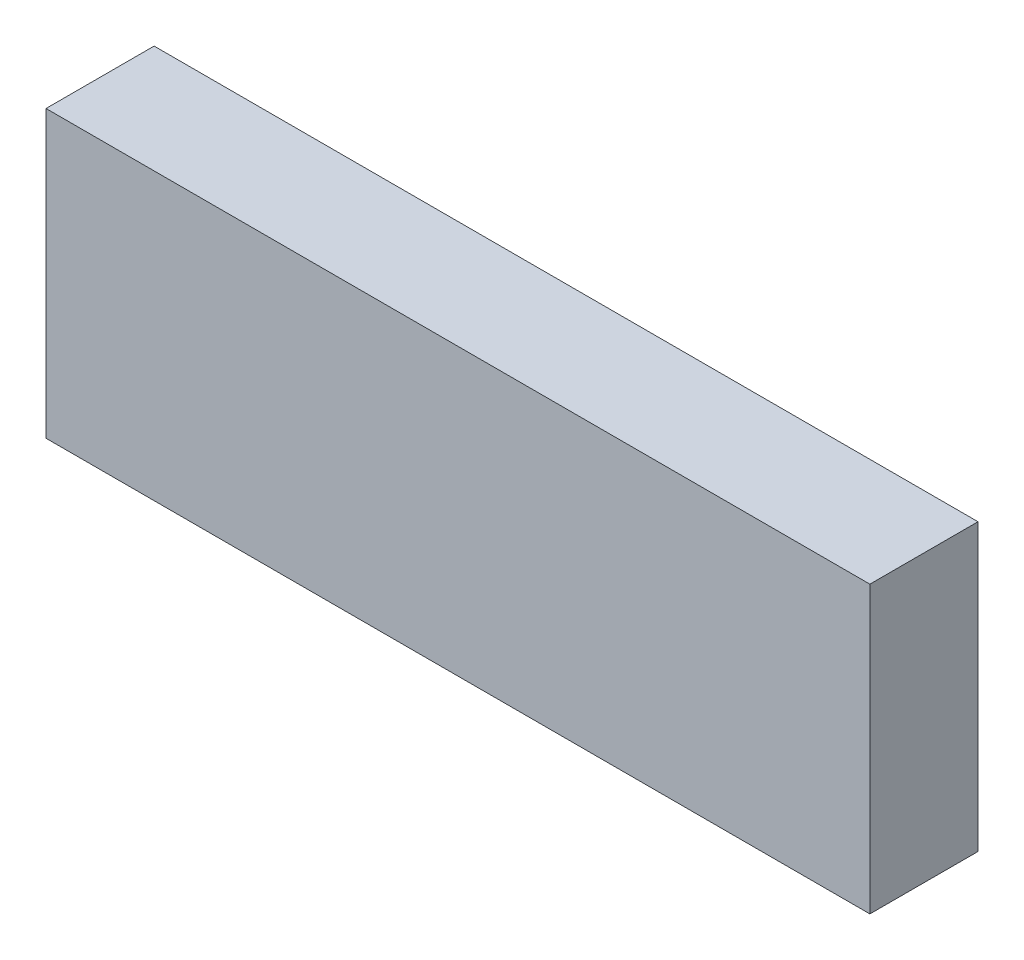
ISO-10303-21;
HEADER;
FILE_DESCRIPTION(('STEP AP214'),'2;1');
FILE_NAME('part.step','',(''),(''),'','','');
FILE_SCHEMA(('AUTOMOTIVE_DESIGN { 1 0 10303 214 1 1 1 1 }'));
ENDSEC;
DATA;
#1=APPLICATION_CONTEXT('core data for automotive mechanical design processes');
#2=APPLICATION_PROTOCOL_DEFINITION('international standard','automotive_design',2000,#1);
#3=PRODUCT_CONTEXT('',#1,'mechanical');
#4=PRODUCT('Part','Part','',(#3));
#5=PRODUCT_RELATED_PRODUCT_CATEGORY('part','',(#4));
#6=PRODUCT_DEFINITION_FORMATION('','',#4);
#7=PRODUCT_DEFINITION_CONTEXT('part definition',#1,'design');
#8=PRODUCT_DEFINITION('design','',#6,#7);
#9=PRODUCT_DEFINITION_SHAPE('','',#8);
#10=(LENGTH_UNIT() NAMED_UNIT(*) SI_UNIT(.MILLI.,.METRE.));
#11=(NAMED_UNIT(*) PLANE_ANGLE_UNIT() SI_UNIT($,.RADIAN.));
#12=(NAMED_UNIT(*) SI_UNIT($,.STERADIAN.) SOLID_ANGLE_UNIT());
#13=UNCERTAINTY_MEASURE_WITH_UNIT(LENGTH_MEASURE(1.E-05),#10,'distance_accuracy_value','');
#14=(GEOMETRIC_REPRESENTATION_CONTEXT(3) GLOBAL_UNCERTAINTY_ASSIGNED_CONTEXT((#13)) GLOBAL_UNIT_ASSIGNED_CONTEXT((#10,
#11,#12)) REPRESENTATION_CONTEXT('',''));
#15=CARTESIAN_POINT('',(0.,0.,0.));
#16=DIRECTION('',(0.,0.,1.));
#17=DIRECTION('',(1.,0.,0.));
#18=AXIS2_PLACEMENT_3D('',#15,#16,#17);
#19=CARTESIAN_POINT('',(-1.27,-1.27,1.));
#20=DIRECTION('',(1.,0.,0.));
#21=DIRECTION('',(0.,0.,-1.));
#22=AXIS2_PLACEMENT_3D('',#19,#20,#21);
#23=PLANE('',#22);
#24=DIRECTION('',(0.,-1.,0.));
#25=VECTOR('',#24,1.);
#26=CARTESIAN_POINT('',(-1.27,-1.27,0.));
#27=LINE('',#26,#25);
#28=CARTESIAN_POINT('',(-1.27,1.3716,0.));
#29=VERTEX_POINT('',#28);
#30=CARTESIAN_POINT('',(-1.27,-1.27,0.));
#31=VERTEX_POINT('',#30);
#32=EDGE_CURVE('E95',#29,#31,#27,.T.);
#33=ORIENTED_EDGE('',*,*,#32,.T.);
#34=DIRECTION('',(0.,0.,-1.));
#35=VECTOR('',#34,1.);
#36=CARTESIAN_POINT('',(-1.27,-1.27,1.));
#37=LINE('',#36,#35);
#38=CARTESIAN_POINT('',(-1.27,-1.27,1.));
#39=VERTEX_POINT('',#38);
#40=EDGE_CURVE('E11',#39,#31,#37,.T.);
#41=ORIENTED_EDGE('',*,*,#40,.F.);
#42=DIRECTION('',(0.,-1.,0.));
#43=VECTOR('',#42,1.);
#44=CARTESIAN_POINT('',(-1.27,-1.27,1.));
#45=LINE('',#44,#43);
#46=CARTESIAN_POINT('',(-1.27,1.3716,1.));
#47=VERTEX_POINT('',#46);
#48=EDGE_CURVE('E83',#47,#39,#45,.T.);
#49=ORIENTED_EDGE('',*,*,#48,.F.);
#50=DIRECTION('',(0.,0.,-1.));
#51=VECTOR('',#50,1.);
#52=CARTESIAN_POINT('',(-1.27,1.3716,1.));
#53=LINE('',#52,#51);
#54=EDGE_CURVE('E91',#47,#29,#53,.T.);
#55=ORIENTED_EDGE('',*,*,#54,.T.);
#56=EDGE_LOOP('',(#33,#41,#49,#55));
#57=FACE_BOUND('',#56,.T.);
#58=ADVANCED_FACE('F32',(#57),#23,.F.);
#59=CARTESIAN_POINT('',(6.35,-1.27,1.));
#60=DIRECTION('',(0.,1.,0.));
#61=DIRECTION('',(0.,0.,1.));
#62=AXIS2_PLACEMENT_3D('',#59,#60,#61);
#63=PLANE('',#62);
#64=DIRECTION('',(1.,0.,0.));
#65=VECTOR('',#64,1.);
#66=CARTESIAN_POINT('',(6.35,-1.27,0.));
#67=LINE('',#66,#65);
#68=CARTESIAN_POINT('',(6.35,-1.27,0.));
#69=VERTEX_POINT('',#68);
#70=EDGE_CURVE('E87',#31,#69,#67,.T.);
#71=ORIENTED_EDGE('',*,*,#70,.T.);
#72=DIRECTION('',(0.,0.,-1.));
#73=VECTOR('',#72,1.);
#74=CARTESIAN_POINT('',(6.35,-1.27,1.));
#75=LINE('',#74,#73);
#76=CARTESIAN_POINT('',(6.35,-1.27,1.));
#77=VERTEX_POINT('',#76);
#78=EDGE_CURVE('E40',#77,#69,#75,.T.);
#79=ORIENTED_EDGE('',*,*,#78,.F.);
#80=DIRECTION('',(1.,0.,0.));
#81=VECTOR('',#80,1.);
#82=CARTESIAN_POINT('',(6.35,-1.27,1.));
#83=LINE('',#82,#81);
#84=EDGE_CURVE('E78',#39,#77,#83,.T.);
#85=ORIENTED_EDGE('',*,*,#84,.F.);
#86=ORIENTED_EDGE('',*,*,#40,.T.);
#87=EDGE_LOOP('',(#71,#79,#85,#86));
#88=FACE_BOUND('',#87,.T.);
#89=ADVANCED_FACE('F86',(#88),#63,.F.);
#90=CARTESIAN_POINT('',(6.35,1.3716,1.));
#91=DIRECTION('',(-1.,0.,0.));
#92=DIRECTION('',(0.,0.,1.));
#93=AXIS2_PLACEMENT_3D('',#90,#91,#92);
#94=PLANE('',#93);
#95=DIRECTION('',(0.,1.,0.));
#96=VECTOR('',#95,1.);
#97=CARTESIAN_POINT('',(6.35,1.3716,0.));
#98=LINE('',#97,#96);
#99=CARTESIAN_POINT('',(6.35,1.3716,0.));
#100=VERTEX_POINT('',#99);
#101=EDGE_CURVE('E65',#69,#100,#98,.T.);
#102=ORIENTED_EDGE('',*,*,#101,.T.);
#103=DIRECTION('',(0.,0.,-1.));
#104=VECTOR('',#103,1.);
#105=CARTESIAN_POINT('',(6.35,1.3716,1.));
#106=LINE('',#105,#104);
#107=CARTESIAN_POINT('',(6.35,1.3716,1.));
#108=VERTEX_POINT('',#107);
#109=EDGE_CURVE('E88',#108,#100,#106,.T.);
#110=ORIENTED_EDGE('',*,*,#109,.F.);
#111=DIRECTION('',(0.,1.,0.));
#112=VECTOR('',#111,1.);
#113=CARTESIAN_POINT('',(6.35,1.3716,1.));
#114=LINE('',#113,#112);
#115=EDGE_CURVE('E81',#77,#108,#114,.T.);
#116=ORIENTED_EDGE('',*,*,#115,.F.);
#117=ORIENTED_EDGE('',*,*,#78,.T.);
#118=EDGE_LOOP('',(#102,#110,#116,#117));
#119=FACE_BOUND('',#118,.T.);
#120=ADVANCED_FACE('F89',(#119),#94,.F.);
#121=CARTESIAN_POINT('',(-1.27,1.3716,1.));
#122=DIRECTION('',(0.,-1.,0.));
#123=DIRECTION('',(0.,0.,-1.));
#124=AXIS2_PLACEMENT_3D('',#121,#122,#123);
#125=PLANE('',#124);
#126=DIRECTION('',(-1.,0.,0.));
#127=VECTOR('',#126,1.);
#128=CARTESIAN_POINT('',(-1.27,1.3716,0.));
#129=LINE('',#128,#127);
#130=EDGE_CURVE('E71',#100,#29,#129,.T.);
#131=ORIENTED_EDGE('',*,*,#130,.T.);
#132=ORIENTED_EDGE('',*,*,#54,.F.);
#133=DIRECTION('',(-1.,0.,0.));
#134=VECTOR('',#133,1.);
#135=CARTESIAN_POINT('',(-1.27,1.3716,1.));
#136=LINE('',#135,#134);
#137=EDGE_CURVE('E48',#108,#47,#136,.T.);
#138=ORIENTED_EDGE('',*,*,#137,.F.);
#139=ORIENTED_EDGE('',*,*,#109,.T.);
#140=EDGE_LOOP('',(#131,#132,#138,#139));
#141=FACE_BOUND('',#140,.T.);
#142=ADVANCED_FACE('F102',(#141),#125,.F.);
#143=CARTESIAN_POINT('',(0.,0.,1.));
#144=DIRECTION('',(0.,0.,-1.));
#145=DIRECTION('',(-1.,0.,0.));
#146=AXIS2_PLACEMENT_3D('',#143,#144,#145);
#147=PLANE('',#146);
#148=ORIENTED_EDGE('',*,*,#48,.T.);
#149=ORIENTED_EDGE('',*,*,#84,.T.);
#150=ORIENTED_EDGE('',*,*,#115,.T.);
#151=ORIENTED_EDGE('',*,*,#137,.T.);
#152=EDGE_LOOP('',(#148,#149,#150,#151));
#153=FACE_BOUND('',#152,.T.);
#154=ADVANCED_FACE('F79',(#153),#147,.F.);
#155=CARTESIAN_POINT('',(0.,0.,0.));
#156=DIRECTION('',(0.,0.,-1.));
#157=DIRECTION('',(-1.,0.,0.));
#158=AXIS2_PLACEMENT_3D('',#155,#156,#157);
#159=PLANE('',#158);
#160=ORIENTED_EDGE('',*,*,#32,.F.);
#161=ORIENTED_EDGE('',*,*,#130,.F.);
#162=ORIENTED_EDGE('',*,*,#101,.F.);
#163=ORIENTED_EDGE('',*,*,#70,.F.);
#164=EDGE_LOOP('',(#160,#161,#162,#163));
#165=FACE_BOUND('',#164,.T.);
#166=ADVANCED_FACE('F105',(#165),#159,.T.);
#167=CLOSED_SHELL('',(#58,#89,#120,#142,#154,#166));
#168=MANIFOLD_SOLID_BREP('B2',#167);
#169=ADVANCED_BREP_SHAPE_REPRESENTATION('',(#18,#168),#14);
#170=SHAPE_DEFINITION_REPRESENTATION(#9,#169);
ENDSEC;
END-ISO-10303-21;
